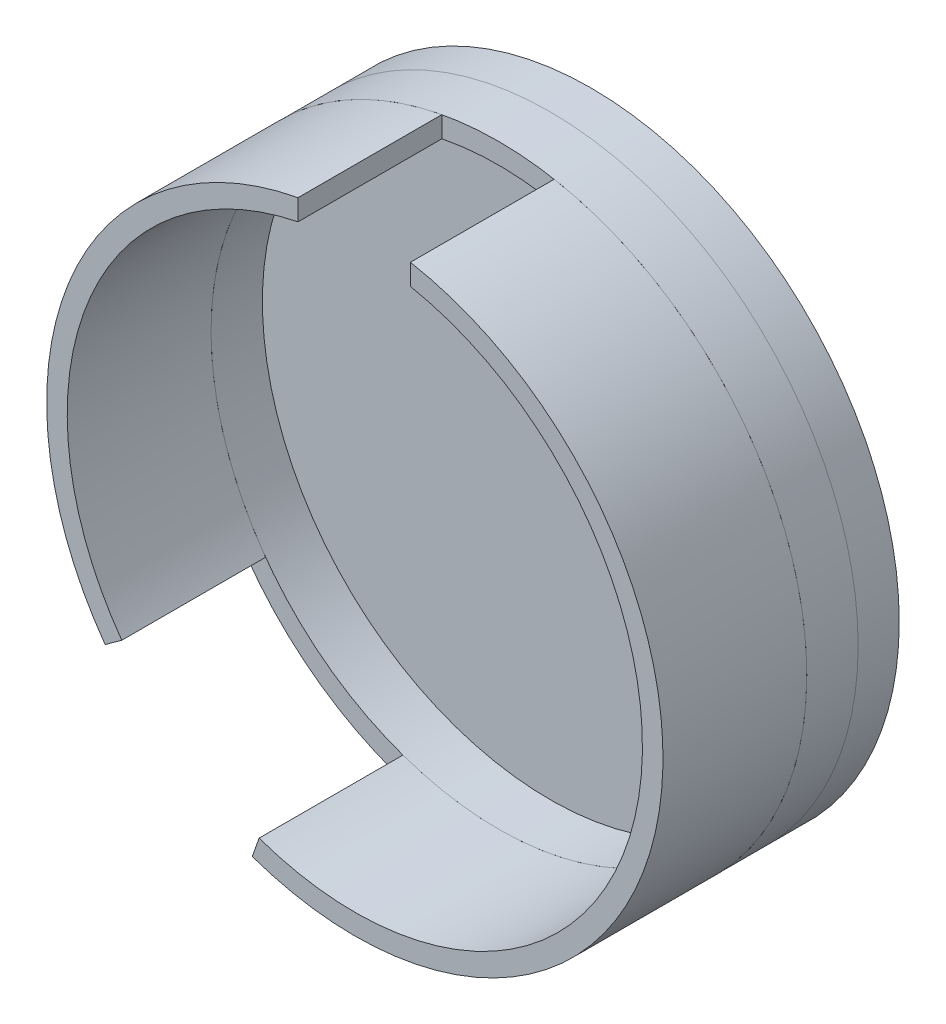
ISO-10303-21;
HEADER;
FILE_DESCRIPTION(('STEP AP214'),'2;1');
FILE_NAME('part.step','',(''),(''),'','','');
FILE_SCHEMA(('AUTOMOTIVE_DESIGN { 1 0 10303 214 1 1 1 1 }'));
ENDSEC;
DATA;
#1=APPLICATION_CONTEXT('core data for automotive mechanical design processes');
#2=APPLICATION_PROTOCOL_DEFINITION('international standard','automotive_design',2000,#1);
#3=PRODUCT_CONTEXT('',#1,'mechanical');
#4=PRODUCT('Part','Part','',(#3));
#5=PRODUCT_RELATED_PRODUCT_CATEGORY('part','',(#4));
#6=PRODUCT_DEFINITION_FORMATION('','',#4);
#7=PRODUCT_DEFINITION_CONTEXT('part definition',#1,'design');
#8=PRODUCT_DEFINITION('design','',#6,#7);
#9=PRODUCT_DEFINITION_SHAPE('','',#8);
#10=(LENGTH_UNIT() NAMED_UNIT(*) SI_UNIT(.MILLI.,.METRE.));
#11=(NAMED_UNIT(*) PLANE_ANGLE_UNIT() SI_UNIT($,.RADIAN.));
#12=(NAMED_UNIT(*) SI_UNIT($,.STERADIAN.) SOLID_ANGLE_UNIT());
#13=UNCERTAINTY_MEASURE_WITH_UNIT(LENGTH_MEASURE(1.E-05),#10,'distance_accuracy_value','');
#14=(GEOMETRIC_REPRESENTATION_CONTEXT(3) GLOBAL_UNCERTAINTY_ASSIGNED_CONTEXT((#13)) GLOBAL_UNIT_ASSIGNED_CONTEXT((#10,
#11,#12)) REPRESENTATION_CONTEXT('',''));
#15=CARTESIAN_POINT('',(0.,0.,0.));
#16=DIRECTION('',(0.,0.,1.));
#17=DIRECTION('',(1.,0.,0.));
#18=AXIS2_PLACEMENT_3D('',#15,#16,#17);
#19=CARTESIAN_POINT('',(13.251724334409,32.7573537163915,51.8987871255241));
#20=DIRECTION('',(0.,0.,-1.));
#21=DIRECTION('',(-1.,0.,0.));
#22=AXIS2_PLACEMENT_3D('',#19,#20,#21);
#23=CYLINDRICAL_SURFACE('',#22,30.);
#24=CARTESIAN_POINT('',(13.251724334409,32.7573537163915,51.8987871255241));
#25=DIRECTION('',(0.,0.,-1.));
#26=DIRECTION('',(-1.,0.,0.));
#27=AXIS2_PLACEMENT_3D('',#24,#25,#26);
#28=CIRCLE('',#27,30.);
#29=CARTESIAN_POINT('',(-16.7482756655909,32.7573537163915,51.8987871255241));
#30=VERTEX_POINT('',#29);
#31=EDGE_CURVE('P0_E10',#30,#30,#28,.T.);
#32=ORIENTED_EDGE('',*,*,#31,.T.);
#33=EDGE_LOOP('',(#32));
#34=FACE_BOUND('',#33,.T.);
#35=CARTESIAN_POINT('',(13.251724334409,32.7573537163915,47.8976333128784));
#36=DIRECTION('',(0.,0.,-1.));
#37=DIRECTION('',(-1.,0.,0.));
#38=AXIS2_PLACEMENT_3D('',#35,#36,#37);
#39=CIRCLE('',#38,30.);
#40=CARTESIAN_POINT('',(-16.7482756655909,32.7573537163915,47.8976333128784));
#41=VERTEX_POINT('',#40);
#42=EDGE_CURVE('P0_E41',#41,#41,#39,.T.);
#43=ORIENTED_EDGE('',*,*,#42,.F.);
#44=EDGE_LOOP('',(#43));
#45=FACE_BOUND('',#44,.T.);
#46=ADVANCED_FACE('P0_F35',(#34,#45),#23,.T.);
#47=CARTESIAN_POINT('',(43.251724334409,32.7573537163915,51.8987871255241));
#48=DIRECTION('',(0.,0.,1.));
#49=DIRECTION('',(1.,0.,0.));
#50=AXIS2_PLACEMENT_3D('',#47,#48,#49);
#51=PLANE('',#50);
#52=ORIENTED_EDGE('',*,*,#31,.F.);
#53=EDGE_LOOP('',(#52));
#54=FACE_BOUND('',#53,.T.);
#55=ADVANCED_FACE('P0_F50',(#54),#51,.T.);
#56=CARTESIAN_POINT('',(13.251724334409,32.7573537163915,47.8976333128784));
#57=DIRECTION('',(0.,0.,-1.));
#58=DIRECTION('',(-1.,0.,0.));
#59=AXIS2_PLACEMENT_3D('',#56,#57,#58);
#60=PLANE('',#59);
#61=ORIENTED_EDGE('',*,*,#42,.T.);
#62=EDGE_LOOP('',(#61));
#63=FACE_BOUND('',#62,.T.);
#64=ADVANCED_FACE('P0_F47',(#63),#60,.T.);
#65=CLOSED_SHELL('',(#46,#55,#64));
#66=MANIFOLD_SOLID_BREP('P0_B2',#65);
#67=CARTESIAN_POINT('',(13.2517243344089,32.7573537163915,70.8987871255241));
#68=DIRECTION('',(0.,0.,-1.));
#69=DIRECTION('',(-0.99999945456443,-0.00104444762516857,0.));
#70=AXIS2_PLACEMENT_3D('',#67,#68,#69);
#71=CYLINDRICAL_SURFACE('',#70,28.);
#72=CARTESIAN_POINT('',(13.2517243344089,32.7573537163915,56.8987871255241));
#73=DIRECTION('',(0.,0.,-1.));
#74=DIRECTION('',(0.99999945456443,0.00104444762516857,0.));
#75=AXIS2_PLACEMENT_3D('',#72,#73,#74);
#76=CIRCLE('',#75,28.);
#77=CARTESIAN_POINT('',(18.6629976861058,60.2294872468113,56.8987871255241));
#78=VERTEX_POINT('',#77);
#79=CARTESIAN_POINT('',(3.93291797764138,6.35356898607174,56.8987871255241));
#80=VERTEX_POINT('',#79);
#81=EDGE_CURVE('P1_E118',#78,#80,#76,.T.);
#82=ORIENTED_EDGE('',*,*,#81,.T.);
#83=DIRECTION('',(0.,0.,-1.));
#84=VECTOR('',#83,1.);
#85=CARTESIAN_POINT('',(3.93291797764138,6.35356898607174,70.8987871255241));
#86=LINE('',#85,#84);
#87=CARTESIAN_POINT('',(3.93291797764138,6.35356898607174,70.8987871255241));
#88=VERTEX_POINT('',#87);
#89=EDGE_CURVE('P1_E12',#88,#80,#86,.T.);
#90=ORIENTED_EDGE('',*,*,#89,.F.);
#91=CARTESIAN_POINT('',(13.2517243344089,32.7573537163915,70.8987871255241));
#92=DIRECTION('',(0.,0.,-1.));
#93=DIRECTION('',(0.99999945456443,0.00104444762516857,0.));
#94=AXIS2_PLACEMENT_3D('',#91,#92,#93);
#95=CIRCLE('',#94,28.);
#96=CARTESIAN_POINT('',(18.6629976861058,60.2294872468113,70.8987871255241));
#97=VERTEX_POINT('',#96);
#98=EDGE_CURVE('P1_E72',#97,#88,#95,.T.);
#99=ORIENTED_EDGE('',*,*,#98,.F.);
#100=DIRECTION('',(0.,0.,-1.));
#101=VECTOR('',#100,1.);
#102=CARTESIAN_POINT('',(18.6629976861058,60.2294872468113,70.8987871255241));
#103=LINE('',#102,#101);
#104=EDGE_CURVE('P1_E85',#97,#78,#103,.T.);
#105=ORIENTED_EDGE('',*,*,#104,.T.);
#106=EDGE_LOOP('',(#82,#90,#99,#105));
#107=FACE_BOUND('',#106,.T.);
#108=ADVANCED_FACE('P1_F20',(#107),#71,.F.);
#109=CARTESIAN_POINT('',(3.93291797764138,6.35356898607174,70.8987871255241));
#110=DIRECTION('',(0.942992311797136,-0.332814512741698,0.));
#111=DIRECTION('',(0.332814512741698,0.942992311797136,0.));
#112=AXIS2_PLACEMENT_3D('',#109,#110,#111);
#113=PLANE('',#112);
#114=DIRECTION('',(-0.332814512741698,-0.942992311797136,0.));
#115=VECTOR('',#114,1.);
#116=CARTESIAN_POINT('',(3.93291797764138,6.35356898607174,56.8987871255241));
#117=LINE('',#116,#115);
#118=CARTESIAN_POINT('',(3.26728895215799,4.46758436247747,56.8987871255241));
#119=VERTEX_POINT('',#118);
#120=EDGE_CURVE('P1_E77',#80,#119,#117,.T.);
#121=ORIENTED_EDGE('',*,*,#120,.T.);
#122=DIRECTION('',(0.,0.,-1.));
#123=VECTOR('',#122,1.);
#124=CARTESIAN_POINT('',(3.26728895215799,4.46758436247747,70.8987871255241));
#125=LINE('',#124,#123);
#126=CARTESIAN_POINT('',(3.26728895215799,4.46758436247747,70.8987871255241));
#127=VERTEX_POINT('',#126);
#128=EDGE_CURVE('P1_E29',#127,#119,#125,.T.);
#129=ORIENTED_EDGE('',*,*,#128,.F.);
#130=DIRECTION('',(-0.332814512741698,-0.942992311797136,0.));
#131=VECTOR('',#130,1.);
#132=CARTESIAN_POINT('',(3.93291797764138,6.35356898607174,70.8987871255241));
#133=LINE('',#132,#131);
#134=EDGE_CURVE('P1_E67',#88,#127,#133,.T.);
#135=ORIENTED_EDGE('',*,*,#134,.F.);
#136=ORIENTED_EDGE('',*,*,#89,.T.);
#137=EDGE_LOOP('',(#121,#129,#135,#136));
#138=FACE_BOUND('',#137,.T.);
#139=ADVANCED_FACE('P1_F76',(#138),#113,.F.);
#140=CARTESIAN_POINT('',(13.2517243344089,32.7573537163915,70.8987871255241));
#141=DIRECTION('',(0.,0.,-1.));
#142=DIRECTION('',(-0.99999945456443,-0.00104444762516857,0.));
#143=AXIS2_PLACEMENT_3D('',#140,#141,#142);
#144=CYLINDRICAL_SURFACE('',#143,30.);
#145=CARTESIAN_POINT('',(13.2517243344089,32.7573537163915,56.8987871255241));
#146=DIRECTION('',(0.,0.,1.));
#147=DIRECTION('',(0.99999945456443,0.00104444762516857,0.));
#148=AXIS2_PLACEMENT_3D('',#145,#146,#147);
#149=CIRCLE('',#148,30.);
#150=CARTESIAN_POINT('',(18.6608709915808,62.2656768209193,56.8987871255241));
#151=VERTEX_POINT('',#150);
#152=EDGE_CURVE('P1_E54',#119,#151,#149,.T.);
#153=ORIENTED_EDGE('',*,*,#152,.T.);
#154=DIRECTION('',(0.,0.,-1.));
#155=VECTOR('',#154,1.);
#156=CARTESIAN_POINT('',(18.6608709915808,62.2656768209193,70.8987871255241));
#157=LINE('',#156,#155);
#158=CARTESIAN_POINT('',(18.6608709915808,62.2656768209193,70.8987871255241));
#159=VERTEX_POINT('',#158);
#160=EDGE_CURVE('P1_E79',#159,#151,#157,.T.);
#161=ORIENTED_EDGE('',*,*,#160,.F.);
#162=CARTESIAN_POINT('',(13.2517243344089,32.7573537163915,70.8987871255241));
#163=DIRECTION('',(0.,0.,1.));
#164=DIRECTION('',(0.99999945456443,0.00104444762516857,0.));
#165=AXIS2_PLACEMENT_3D('',#162,#163,#164);
#166=CIRCLE('',#165,30.);
#167=EDGE_CURVE('P1_E70',#127,#159,#166,.T.);
#168=ORIENTED_EDGE('',*,*,#167,.F.);
#169=ORIENTED_EDGE('',*,*,#128,.T.);
#170=EDGE_LOOP('',(#153,#161,#168,#169));
#171=FACE_BOUND('',#170,.T.);
#172=ADVANCED_FACE('P1_F80',(#171),#144,.T.);
#173=CARTESIAN_POINT('',(18.6629976861058,60.2294872468113,70.8987871255241));
#174=DIRECTION('',(0.99999945456443,0.00104444762516857,0.));
#175=DIRECTION('',(0.,0.,-1.));
#176=AXIS2_PLACEMENT_3D('',#173,#174,#175);
#177=PLANE('',#176);
#178=DIRECTION('',(0.00104444762516857,-0.99999945456443,0.));
#179=VECTOR('',#178,1.);
#180=CARTESIAN_POINT('',(18.6629976861058,60.2294872468113,56.8987871255241));
#181=LINE('',#180,#179);
#182=EDGE_CURVE('P1_E60',#151,#78,#181,.T.);
#183=ORIENTED_EDGE('',*,*,#182,.T.);
#184=ORIENTED_EDGE('',*,*,#104,.F.);
#185=DIRECTION('',(0.00104444762516857,-0.99999945456443,0.));
#186=VECTOR('',#185,1.);
#187=CARTESIAN_POINT('',(18.6629976861058,60.2294872468113,70.8987871255241));
#188=LINE('',#187,#186);
#189=EDGE_CURVE('P1_E37',#159,#97,#188,.T.);
#190=ORIENTED_EDGE('',*,*,#189,.F.);
#191=ORIENTED_EDGE('',*,*,#160,.T.);
#192=EDGE_LOOP('',(#183,#184,#190,#191));
#193=FACE_BOUND('',#192,.T.);
#194=ADVANCED_FACE('P1_F113',(#193),#177,.F.);
#195=CARTESIAN_POINT('',(13.2517243344089,32.7573537163915,70.8987871255241));
#196=DIRECTION('',(0.,0.,1.));
#197=DIRECTION('',(0.99999945456443,0.00104444762516857,0.));
#198=AXIS2_PLACEMENT_3D('',#195,#196,#197);
#199=PLANE('',#198);
#200=ORIENTED_EDGE('',*,*,#98,.T.);
#201=ORIENTED_EDGE('',*,*,#134,.T.);
#202=ORIENTED_EDGE('',*,*,#167,.T.);
#203=ORIENTED_EDGE('',*,*,#189,.T.);
#204=EDGE_LOOP('',(#200,#201,#202,#203));
#205=FACE_BOUND('',#204,.T.);
#206=ADVANCED_FACE('P1_F68',(#205),#199,.T.);
#207=CARTESIAN_POINT('',(13.2517243344089,32.7573537163915,56.8987871255241));
#208=DIRECTION('',(0.,0.,1.));
#209=DIRECTION('',(0.99999945456443,0.00104444762516857,0.));
#210=AXIS2_PLACEMENT_3D('',#207,#208,#209);
#211=PLANE('',#210);
#212=ORIENTED_EDGE('',*,*,#81,.F.);
#213=ORIENTED_EDGE('',*,*,#182,.F.);
#214=ORIENTED_EDGE('',*,*,#152,.F.);
#215=ORIENTED_EDGE('',*,*,#120,.F.);
#216=EDGE_LOOP('',(#212,#213,#214,#215));
#217=FACE_BOUND('',#216,.T.);
#218=ADVANCED_FACE('P1_F116',(#217),#211,.F.);
#219=CLOSED_SHELL('',(#108,#139,#172,#194,#206,#218));
#220=MANIFOLD_SOLID_BREP('P1_B1',#219);
#221=CARTESIAN_POINT('',(13.251724334409,32.7573537163915,56.8987871255241));
#222=DIRECTION('',(0.,0.,1.));
#223=DIRECTION('',(1.,0.,0.));
#224=AXIS2_PLACEMENT_3D('',#221,#222,#223);
#225=PLANE('',#224);
#226=CARTESIAN_POINT('',(13.251724334409,32.7573537163915,56.8987871255241));
#227=DIRECTION('',(0.,0.,1.));
#228=DIRECTION('',(1.,0.,0.));
#229=AXIS2_PLACEMENT_3D('',#226,#227,#228);
#230=CIRCLE('',#229,30.);
#231=CARTESIAN_POINT('',(43.251724334409,32.7573537163915,56.8987871255241));
#232=VERTEX_POINT('',#231);
#233=EDGE_CURVE('P2_E10',#232,#232,#230,.T.);
#234=ORIENTED_EDGE('',*,*,#233,.T.);
#235=EDGE_LOOP('',(#234));
#236=FACE_BOUND('',#235,.T.);
#237=CARTESIAN_POINT('',(13.251724334409,32.7573537163915,56.8987871255241));
#238=DIRECTION('',(0.,0.,1.));
#239=DIRECTION('',(1.,0.,0.));
#240=AXIS2_PLACEMENT_3D('',#237,#238,#239);
#241=CIRCLE('',#240,28.);
#242=CARTESIAN_POINT('',(41.2517243344091,32.7573537163915,56.8987871255241));
#243=VERTEX_POINT('',#242);
#244=EDGE_CURVE('P2_E32',#243,#243,#241,.T.);
#245=ORIENTED_EDGE('',*,*,#244,.F.);
#246=EDGE_LOOP('',(#245));
#247=FACE_BOUND('',#246,.T.);
#248=ADVANCED_FACE('P2_F17',(#236,#247),#225,.T.);
#249=CARTESIAN_POINT('',(13.251724334409,32.7573537163915,51.8987871255241));
#250=DIRECTION('',(0.,0.,1.));
#251=DIRECTION('',(1.,0.,0.));
#252=AXIS2_PLACEMENT_3D('',#249,#250,#251);
#253=PLANE('',#252);
#254=CARTESIAN_POINT('',(13.251724334409,32.7573537163915,51.8987871255241));
#255=DIRECTION('',(0.,0.,1.));
#256=DIRECTION('',(1.,0.,0.));
#257=AXIS2_PLACEMENT_3D('',#254,#255,#256);
#258=CIRCLE('',#257,30.);
#259=CARTESIAN_POINT('',(43.251724334409,32.7573537163915,51.8987871255241));
#260=VERTEX_POINT('',#259);
#261=EDGE_CURVE('P2_E21',#260,#260,#258,.T.);
#262=ORIENTED_EDGE('',*,*,#261,.F.);
#263=EDGE_LOOP('',(#262));
#264=FACE_BOUND('',#263,.T.);
#265=CARTESIAN_POINT('',(13.251724334409,32.7573537163915,51.8987871255241));
#266=DIRECTION('',(0.,0.,1.));
#267=DIRECTION('',(1.,0.,0.));
#268=AXIS2_PLACEMENT_3D('',#265,#266,#267);
#269=CIRCLE('',#268,28.);
#270=CARTESIAN_POINT('',(41.2517243344091,32.7573537163915,51.8987871255241));
#271=VERTEX_POINT('',#270);
#272=EDGE_CURVE('P2_E34',#271,#271,#269,.T.);
#273=ORIENTED_EDGE('',*,*,#272,.T.);
#274=EDGE_LOOP('',(#273));
#275=FACE_BOUND('',#274,.T.);
#276=ADVANCED_FACE('P2_F48',(#264,#275),#253,.F.);
#277=CARTESIAN_POINT('',(13.251724334409,32.7573537163915,56.8987871255241));
#278=DIRECTION('',(0.,0.,-1.));
#279=DIRECTION('',(-1.,0.,0.));
#280=AXIS2_PLACEMENT_3D('',#277,#278,#279);
#281=CYLINDRICAL_SURFACE('',#280,30.);
#282=ORIENTED_EDGE('',*,*,#233,.F.);
#283=EDGE_LOOP('',(#282));
#284=FACE_BOUND('',#283,.T.);
#285=ORIENTED_EDGE('',*,*,#261,.T.);
#286=EDGE_LOOP('',(#285));
#287=FACE_BOUND('',#286,.T.);
#288=ADVANCED_FACE('P2_F19',(#284,#287),#281,.T.);
#289=CARTESIAN_POINT('',(13.251724334409,32.7573537163915,56.8987871255241));
#290=DIRECTION('',(0.,0.,-1.));
#291=DIRECTION('',(-1.,0.,0.));
#292=AXIS2_PLACEMENT_3D('',#289,#290,#291);
#293=CYLINDRICAL_SURFACE('',#292,28.);
#294=ORIENTED_EDGE('',*,*,#244,.T.);
#295=EDGE_LOOP('',(#294));
#296=FACE_BOUND('',#295,.T.);
#297=ORIENTED_EDGE('',*,*,#272,.F.);
#298=EDGE_LOOP('',(#297));
#299=FACE_BOUND('',#298,.T.);
#300=ADVANCED_FACE('P2_F50',(#296,#299),#293,.F.);
#301=CLOSED_SHELL('',(#248,#276,#288,#300));
#302=MANIFOLD_SOLID_BREP('P2_B1',#301);
#303=CARTESIAN_POINT('',(13.2517243344089,32.7573537163915,70.8987871255241));
#304=DIRECTION('',(0.,0.,-1.));
#305=DIRECTION('',(-0.99999945456443,-0.00104444762516857,0.));
#306=AXIS2_PLACEMENT_3D('',#303,#304,#305);
#307=CYLINDRICAL_SURFACE('',#306,28.);
#308=CARTESIAN_POINT('',(13.2517243344089,32.7573537163915,56.8987871255241));
#309=DIRECTION('',(0.,0.,-1.));
#310=DIRECTION('',(0.99999945456443,0.00104444762516857,0.));
#311=AXIS2_PLACEMENT_3D('',#308,#309,#310);
#312=CIRCLE('',#311,28.);
#313=CARTESIAN_POINT('',(-9.43561769880604,16.3474630565511,56.8987871255241));
#314=VERTEX_POINT('',#313);
#315=CARTESIAN_POINT('',(7.72305253880492,60.2061021063727,56.8987871255241));
#316=VERTEX_POINT('',#315);
#317=EDGE_CURVE('P3_E113',#314,#316,#312,.T.);
#318=ORIENTED_EDGE('',*,*,#317,.T.);
#319=DIRECTION('',(0.,0.,-1.));
#320=VECTOR('',#319,1.);
#321=CARTESIAN_POINT('',(7.72305253880492,60.2061021063727,70.8987871255241));
#322=LINE('',#321,#320);
#323=CARTESIAN_POINT('',(7.72305253880492,60.2061021063727,70.8987871255241));
#324=VERTEX_POINT('',#323);
#325=EDGE_CURVE('P3_E12',#324,#316,#322,.T.);
#326=ORIENTED_EDGE('',*,*,#325,.F.);
#327=CARTESIAN_POINT('',(13.2517243344089,32.7573537163915,70.8987871255241));
#328=DIRECTION('',(0.,0.,-1.));
#329=DIRECTION('',(0.99999945456443,0.00104444762516857,0.));
#330=AXIS2_PLACEMENT_3D('',#327,#328,#329);
#331=CIRCLE('',#330,28.);
#332=CARTESIAN_POINT('',(-9.43561769880604,16.3474630565511,70.8987871255241));
#333=VERTEX_POINT('',#332);
#334=EDGE_CURVE('P3_E72',#333,#324,#331,.T.);
#335=ORIENTED_EDGE('',*,*,#334,.F.);
#336=DIRECTION('',(0.,0.,-1.));
#337=VECTOR('',#336,1.);
#338=CARTESIAN_POINT('',(-9.43561769880604,16.3474630565511,70.8987871255241));
#339=LINE('',#338,#337);
#340=EDGE_CURVE('P3_E85',#333,#314,#339,.T.);
#341=ORIENTED_EDGE('',*,*,#340,.T.);
#342=EDGE_LOOP('',(#318,#326,#335,#341));
#343=FACE_BOUND('',#342,.T.);
#344=ADVANCED_FACE('P3_F20',(#343),#307,.F.);
#345=CARTESIAN_POINT('',(7.72092498188489,62.2431173748441,70.8987871255241));
#346=DIRECTION('',(-0.99999945456443,-0.00104444762516857,0.));
#347=DIRECTION('',(0.,0.,1.));
#348=AXIS2_PLACEMENT_3D('',#345,#346,#347);
#349=PLANE('',#348);
#350=DIRECTION('',(-0.00104444762516857,0.99999945456443,0.));
#351=VECTOR('',#350,1.);
#352=CARTESIAN_POINT('',(7.72092498188489,62.2431173748441,56.8987871255241));
#353=LINE('',#352,#351);
#354=CARTESIAN_POINT('',(7.72092498188489,62.2431173748441,56.8987871255241));
#355=VERTEX_POINT('',#354);
#356=EDGE_CURVE('P3_E77',#316,#355,#353,.T.);
#357=ORIENTED_EDGE('',*,*,#356,.T.);
#358=DIRECTION('',(0.,0.,-1.));
#359=VECTOR('',#358,1.);
#360=CARTESIAN_POINT('',(7.72092498188489,62.2431173748441,70.8987871255241));
#361=LINE('',#360,#359);
#362=CARTESIAN_POINT('',(7.72092498188489,62.2431173748441,70.8987871255241));
#363=VERTEX_POINT('',#362);
#364=EDGE_CURVE('P3_E29',#363,#355,#361,.T.);
#365=ORIENTED_EDGE('',*,*,#364,.F.);
#366=DIRECTION('',(-0.00104444762516857,0.99999945456443,0.));
#367=VECTOR('',#366,1.);
#368=CARTESIAN_POINT('',(7.72092498188489,62.2431173748441,70.8987871255241));
#369=LINE('',#368,#367);
#370=EDGE_CURVE('P3_E67',#324,#363,#369,.T.);
#371=ORIENTED_EDGE('',*,*,#370,.F.);
#372=ORIENTED_EDGE('',*,*,#325,.T.);
#373=EDGE_LOOP('',(#357,#365,#371,#372));
#374=FACE_BOUND('',#373,.T.);
#375=ADVANCED_FACE('P3_F76',(#374),#349,.F.);
#376=CARTESIAN_POINT('',(13.2517243344089,32.7573537163915,70.8987871255241));
#377=DIRECTION('',(0.,0.,-1.));
#378=DIRECTION('',(-0.99999945456443,-0.00104444762516857,0.));
#379=AXIS2_PLACEMENT_3D('',#376,#377,#378);
#380=CYLINDRICAL_SURFACE('',#379,30.);
#381=CARTESIAN_POINT('',(13.2517243344089,32.7573537163915,56.8987871255241));
#382=DIRECTION('',(0.,0.,1.));
#383=DIRECTION('',(0.99999945456443,0.00104444762516857,0.));
#384=AXIS2_PLACEMENT_3D('',#381,#382,#383);
#385=CIRCLE('',#384,30.);
#386=CARTESIAN_POINT('',(-11.05614212975,15.1753280094197,56.8987871255241));
#387=VERTEX_POINT('',#386);
#388=EDGE_CURVE('P3_E54',#355,#387,#385,.T.);
#389=ORIENTED_EDGE('',*,*,#388,.T.);
#390=DIRECTION('',(0.,0.,-1.));
#391=VECTOR('',#390,1.);
#392=CARTESIAN_POINT('',(-11.05614212975,15.1753280094197,70.8987871255241));
#393=LINE('',#392,#391);
#394=CARTESIAN_POINT('',(-11.05614212975,15.1753280094197,70.8987871255241));
#395=VERTEX_POINT('',#394);
#396=EDGE_CURVE('P3_E79',#395,#387,#393,.T.);
#397=ORIENTED_EDGE('',*,*,#396,.F.);
#398=CARTESIAN_POINT('',(13.2517243344089,32.7573537163915,70.8987871255241));
#399=DIRECTION('',(0.,0.,1.));
#400=DIRECTION('',(0.99999945456443,0.00104444762516857,0.));
#401=AXIS2_PLACEMENT_3D('',#398,#399,#400);
#402=CIRCLE('',#401,30.);
#403=EDGE_CURVE('P3_E70',#363,#395,#402,.T.);
#404=ORIENTED_EDGE('',*,*,#403,.F.);
#405=ORIENTED_EDGE('',*,*,#364,.T.);
#406=EDGE_LOOP('',(#389,#397,#404,#405));
#407=FACE_BOUND('',#406,.T.);
#408=ADVANCED_FACE('P3_F80',(#407),#380,.T.);
#409=CARTESIAN_POINT('',(-11.05614212975,15.1753280094197,70.8987871255241));
#410=DIRECTION('',(-0.586067523565727,0.810262215471964,0.));
#411=DIRECTION('',(-0.810262215471964,-0.586067523565727,0.));
#412=AXIS2_PLACEMENT_3D('',#409,#410,#411);
#413=PLANE('',#412);
#414=DIRECTION('',(0.810262215471964,0.586067523565727,0.));
#415=VECTOR('',#414,1.);
#416=CARTESIAN_POINT('',(-11.05614212975,15.1753280094197,56.8987871255241));
#417=LINE('',#416,#415);
#418=EDGE_CURVE('P3_E60',#387,#314,#417,.T.);
#419=ORIENTED_EDGE('',*,*,#418,.T.);
#420=ORIENTED_EDGE('',*,*,#340,.F.);
#421=DIRECTION('',(0.810262215471964,0.586067523565727,0.));
#422=VECTOR('',#421,1.);
#423=CARTESIAN_POINT('',(-11.05614212975,15.1753280094197,70.8987871255241));
#424=LINE('',#423,#422);
#425=EDGE_CURVE('P3_E37',#395,#333,#424,.T.);
#426=ORIENTED_EDGE('',*,*,#425,.F.);
#427=ORIENTED_EDGE('',*,*,#396,.T.);
#428=EDGE_LOOP('',(#419,#420,#426,#427));
#429=FACE_BOUND('',#428,.T.);
#430=ADVANCED_FACE('P3_F108',(#429),#413,.F.);
#431=CARTESIAN_POINT('',(13.2517243344089,32.7573537163915,70.8987871255241));
#432=DIRECTION('',(0.,0.,1.));
#433=DIRECTION('',(0.99999945456443,0.00104444762516857,0.));
#434=AXIS2_PLACEMENT_3D('',#431,#432,#433);
#435=PLANE('',#434);
#436=ORIENTED_EDGE('',*,*,#334,.T.);
#437=ORIENTED_EDGE('',*,*,#370,.T.);
#438=ORIENTED_EDGE('',*,*,#403,.T.);
#439=ORIENTED_EDGE('',*,*,#425,.T.);
#440=EDGE_LOOP('',(#436,#437,#438,#439));
#441=FACE_BOUND('',#440,.T.);
#442=ADVANCED_FACE('P3_F68',(#441),#435,.T.);
#443=CARTESIAN_POINT('',(13.2517243344089,32.7573537163915,56.8987871255241));
#444=DIRECTION('',(0.,0.,1.));
#445=DIRECTION('',(0.99999945456443,0.00104444762516857,0.));
#446=AXIS2_PLACEMENT_3D('',#443,#444,#445);
#447=PLANE('',#446);
#448=ORIENTED_EDGE('',*,*,#317,.F.);
#449=ORIENTED_EDGE('',*,*,#418,.F.);
#450=ORIENTED_EDGE('',*,*,#388,.F.);
#451=ORIENTED_EDGE('',*,*,#356,.F.);
#452=EDGE_LOOP('',(#448,#449,#450,#451));
#453=FACE_BOUND('',#452,.T.);
#454=ADVANCED_FACE('P3_F111',(#453),#447,.F.);
#455=CLOSED_SHELL('',(#344,#375,#408,#430,#442,#454));
#456=MANIFOLD_SOLID_BREP('P3_B1',#455);
#457=ADVANCED_BREP_SHAPE_REPRESENTATION('',(#18,#66,#220,#302,#456),#14);
#458=SHAPE_DEFINITION_REPRESENTATION(#9,#457);
ENDSEC;
END-ISO-10303-21;
